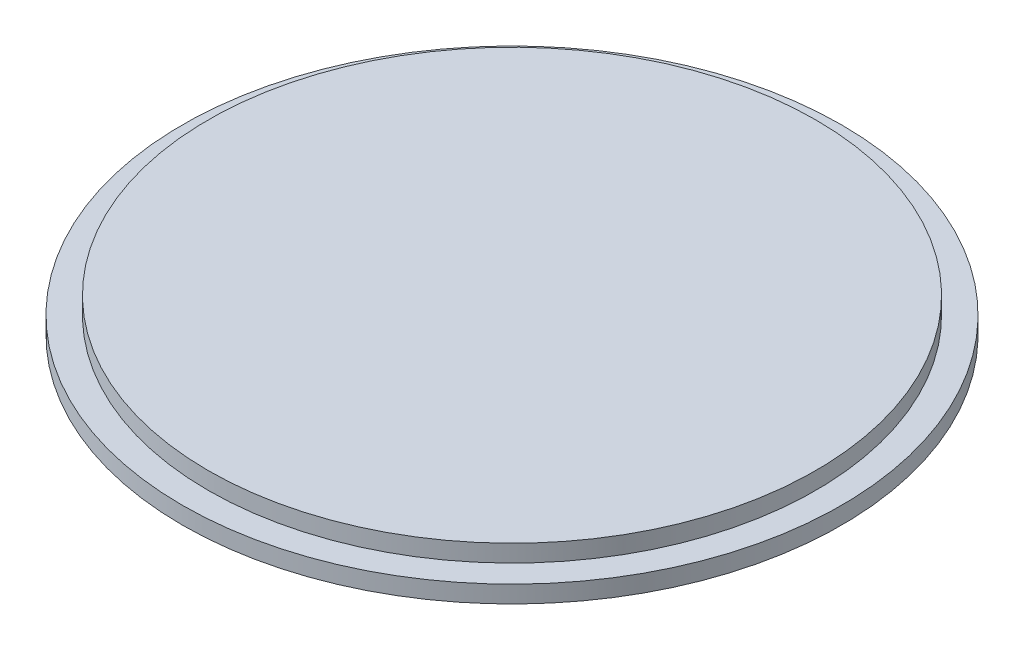
ISO-10303-21;
HEADER;
FILE_DESCRIPTION(('STEP AP214'),'2;1');
FILE_NAME('part.step','',(''),(''),'','','');
FILE_SCHEMA(('AUTOMOTIVE_DESIGN { 1 0 10303 214 1 1 1 1 }'));
ENDSEC;
DATA;
#1=APPLICATION_CONTEXT('core data for automotive mechanical design processes');
#2=APPLICATION_PROTOCOL_DEFINITION('international standard','automotive_design',2000,#1);
#3=PRODUCT_CONTEXT('',#1,'mechanical');
#4=PRODUCT('Part','Part','',(#3));
#5=PRODUCT_RELATED_PRODUCT_CATEGORY('part','',(#4));
#6=PRODUCT_DEFINITION_FORMATION('','',#4);
#7=PRODUCT_DEFINITION_CONTEXT('part definition',#1,'design');
#8=PRODUCT_DEFINITION('design','',#6,#7);
#9=PRODUCT_DEFINITION_SHAPE('','',#8);
#10=(LENGTH_UNIT() NAMED_UNIT(*) SI_UNIT(.MILLI.,.METRE.));
#11=(NAMED_UNIT(*) PLANE_ANGLE_UNIT() SI_UNIT($,.RADIAN.));
#12=(NAMED_UNIT(*) SI_UNIT($,.STERADIAN.) SOLID_ANGLE_UNIT());
#13=UNCERTAINTY_MEASURE_WITH_UNIT(LENGTH_MEASURE(1.E-05),#10,'distance_accuracy_value','');
#14=(GEOMETRIC_REPRESENTATION_CONTEXT(3) GLOBAL_UNCERTAINTY_ASSIGNED_CONTEXT((#13)) GLOBAL_UNIT_ASSIGNED_CONTEXT((#10,
#11,#12)) REPRESENTATION_CONTEXT('',''));
#15=CARTESIAN_POINT('',(0.,0.,0.));
#16=DIRECTION('',(0.,0.,1.));
#17=DIRECTION('',(1.,0.,0.));
#18=AXIS2_PLACEMENT_3D('',#15,#16,#17);
#19=CARTESIAN_POINT('',(0.,3.,0.));
#20=DIRECTION('',(0.,-1.,0.));
#21=DIRECTION('',(0.,0.,-1.));
#22=AXIS2_PLACEMENT_3D('',#19,#20,#21);
#23=CYLINDRICAL_SURFACE('',#22,57.5);
#24=CARTESIAN_POINT('',(0.,3.,0.));
#25=DIRECTION('',(0.,1.,0.));
#26=DIRECTION('',(0.,0.,1.));
#27=AXIS2_PLACEMENT_3D('',#24,#25,#26);
#28=CIRCLE('',#27,57.5);
#29=CARTESIAN_POINT('',(0.,3.,57.5));
#30=VERTEX_POINT('',#29);
#31=EDGE_CURVE('E45',#30,#30,#28,.T.);
#32=ORIENTED_EDGE('',*,*,#31,.F.);
#33=EDGE_LOOP('',(#32));
#34=FACE_BOUND('',#33,.T.);
#35=CARTESIAN_POINT('',(0.,0.,0.));
#36=DIRECTION('',(0.,1.,0.));
#37=DIRECTION('',(0.,0.,1.));
#38=AXIS2_PLACEMENT_3D('',#35,#36,#37);
#39=CIRCLE('',#38,57.5);
#40=CARTESIAN_POINT('',(0.,0.,57.5));
#41=VERTEX_POINT('',#40);
#42=EDGE_CURVE('E40',#41,#41,#39,.T.);
#43=ORIENTED_EDGE('',*,*,#42,.T.);
#44=EDGE_LOOP('',(#43));
#45=FACE_BOUND('',#44,.T.);
#46=ADVANCED_FACE('F37',(#34,#45),#23,.T.);
#47=CARTESIAN_POINT('',(0.,3.,0.));
#48=DIRECTION('',(0.,1.,0.));
#49=DIRECTION('',(0.,0.,1.));
#50=AXIS2_PLACEMENT_3D('',#47,#48,#49);
#51=PLANE('',#50);
#52=CARTESIAN_POINT('',(0.,3.,0.));
#53=DIRECTION('',(0.,1.,0.));
#54=DIRECTION('',(0.,0.,1.));
#55=AXIS2_PLACEMENT_3D('',#52,#53,#54);
#56=CIRCLE('',#55,53.);
#57=CARTESIAN_POINT('',(0.,3.,53.));
#58=VERTEX_POINT('',#57);
#59=EDGE_CURVE('E10',#58,#58,#56,.T.);
#60=ORIENTED_EDGE('',*,*,#59,.F.);
#61=EDGE_LOOP('',(#60));
#62=FACE_BOUND('',#61,.T.);
#63=ORIENTED_EDGE('',*,*,#31,.T.);
#64=EDGE_LOOP('',(#63));
#65=FACE_BOUND('',#64,.T.);
#66=ADVANCED_FACE('F65',(#62,#65),#51,.T.);
#67=CARTESIAN_POINT('',(0.,0.,0.));
#68=DIRECTION('',(0.,1.,0.));
#69=DIRECTION('',(0.,0.,1.));
#70=AXIS2_PLACEMENT_3D('',#67,#68,#69);
#71=PLANE('',#70);
#72=ORIENTED_EDGE('',*,*,#42,.F.);
#73=EDGE_LOOP('',(#72));
#74=FACE_BOUND('',#73,.T.);
#75=ADVANCED_FACE('F62',(#74),#71,.F.);
#76=CARTESIAN_POINT('',(0.,6.,0.));
#77=DIRECTION('',(0.,-1.,0.));
#78=DIRECTION('',(0.,0.,-1.));
#79=AXIS2_PLACEMENT_3D('',#76,#77,#78);
#80=CYLINDRICAL_SURFACE('',#79,53.);
#81=CARTESIAN_POINT('',(0.,6.,0.));
#82=DIRECTION('',(0.,1.,0.));
#83=DIRECTION('',(0.,0.,1.));
#84=AXIS2_PLACEMENT_3D('',#81,#82,#83);
#85=CIRCLE('',#84,53.);
#86=CARTESIAN_POINT('',(0.,6.,53.));
#87=VERTEX_POINT('',#86);
#88=EDGE_CURVE('E52',#87,#87,#85,.T.);
#89=ORIENTED_EDGE('',*,*,#88,.F.);
#90=EDGE_LOOP('',(#89));
#91=FACE_BOUND('',#90,.T.);
#92=ORIENTED_EDGE('',*,*,#59,.T.);
#93=EDGE_LOOP('',(#92));
#94=FACE_BOUND('',#93,.T.);
#95=ADVANCED_FACE('F64',(#91,#94),#80,.T.);
#96=CARTESIAN_POINT('',(0.,6.,0.));
#97=DIRECTION('',(0.,1.,0.));
#98=DIRECTION('',(0.,0.,1.));
#99=AXIS2_PLACEMENT_3D('',#96,#97,#98);
#100=PLANE('',#99);
#101=ORIENTED_EDGE('',*,*,#88,.T.);
#102=EDGE_LOOP('',(#101));
#103=FACE_BOUND('',#102,.T.);
#104=ADVANCED_FACE('F70',(#103),#100,.T.);
#105=CLOSED_SHELL('',(#46,#66,#75,#95,#104));
#106=MANIFOLD_SOLID_BREP('B2',#105);
#107=ADVANCED_BREP_SHAPE_REPRESENTATION('',(#18,#106),#14);
#108=SHAPE_DEFINITION_REPRESENTATION(#9,#107);
ENDSEC;
END-ISO-10303-21;
